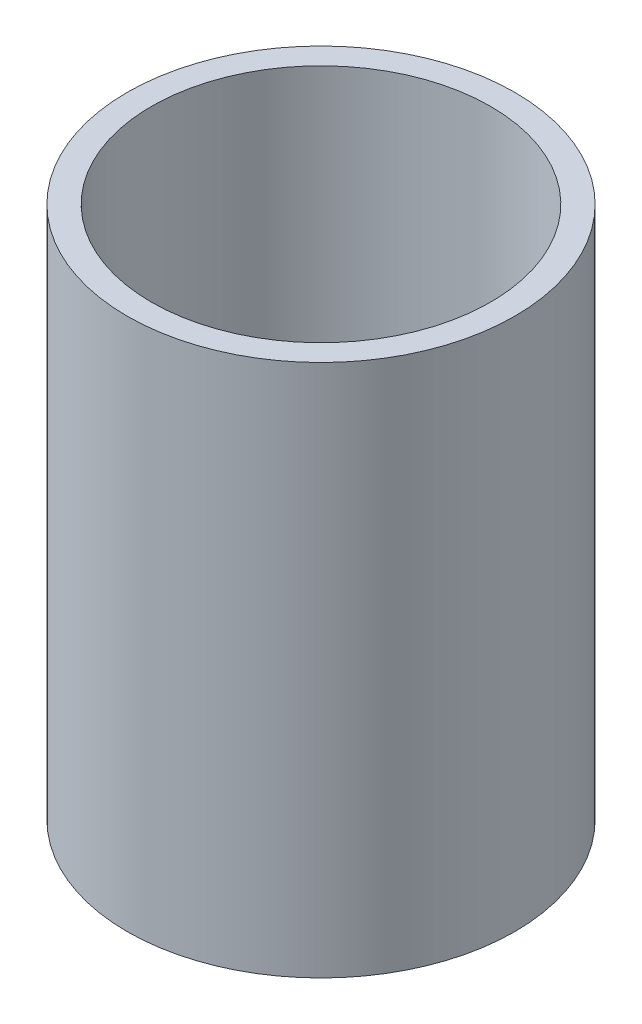
ISO-10303-21;
HEADER;
FILE_DESCRIPTION(('STEP AP214'),'2;1');
FILE_NAME('part.step','',(''),(''),'','','');
FILE_SCHEMA(('AUTOMOTIVE_DESIGN { 1 0 10303 214 1 1 1 1 }'));
ENDSEC;
DATA;
#1=APPLICATION_CONTEXT('core data for automotive mechanical design processes');
#2=APPLICATION_PROTOCOL_DEFINITION('international standard','automotive_design',2000,#1);
#3=PRODUCT_CONTEXT('',#1,'mechanical');
#4=PRODUCT('Part','Part','',(#3));
#5=PRODUCT_RELATED_PRODUCT_CATEGORY('part','',(#4));
#6=PRODUCT_DEFINITION_FORMATION('','',#4);
#7=PRODUCT_DEFINITION_CONTEXT('part definition',#1,'design');
#8=PRODUCT_DEFINITION('design','',#6,#7);
#9=PRODUCT_DEFINITION_SHAPE('','',#8);
#10=(LENGTH_UNIT() NAMED_UNIT(*) SI_UNIT(.MILLI.,.METRE.));
#11=(NAMED_UNIT(*) PLANE_ANGLE_UNIT() SI_UNIT($,.RADIAN.));
#12=(NAMED_UNIT(*) SI_UNIT($,.STERADIAN.) SOLID_ANGLE_UNIT());
#13=UNCERTAINTY_MEASURE_WITH_UNIT(LENGTH_MEASURE(1.E-05),#10,'distance_accuracy_value','');
#14=(GEOMETRIC_REPRESENTATION_CONTEXT(3) GLOBAL_UNCERTAINTY_ASSIGNED_CONTEXT((#13)) GLOBAL_UNIT_ASSIGNED_CONTEXT((#10,
#11,#12)) REPRESENTATION_CONTEXT('',''));
#15=CARTESIAN_POINT('',(0.,0.,0.));
#16=DIRECTION('',(0.,0.,1.));
#17=DIRECTION('',(1.,0.,0.));
#18=AXIS2_PLACEMENT_3D('',#15,#16,#17);
#19=CARTESIAN_POINT('',(0.,55.,0.));
#20=DIRECTION('',(0.,1.,0.));
#21=DIRECTION('',(0.,0.,1.));
#22=AXIS2_PLACEMENT_3D('',#19,#20,#21);
#23=PLANE('',#22);
#24=CARTESIAN_POINT('',(0.,55.,0.));
#25=DIRECTION('',(0.,1.,0.));
#26=DIRECTION('',(0.,0.,1.));
#27=AXIS2_PLACEMENT_3D('',#24,#25,#26);
#28=CIRCLE('',#27,40.);
#29=CARTESIAN_POINT('',(0.,55.,40.));
#30=VERTEX_POINT('',#29);
#31=EDGE_CURVE('E10',#30,#30,#28,.T.);
#32=ORIENTED_EDGE('',*,*,#31,.T.);
#33=EDGE_LOOP('',(#32));
#34=FACE_BOUND('',#33,.T.);
#35=CARTESIAN_POINT('',(0.,55.,0.));
#36=DIRECTION('',(0.,1.,0.));
#37=DIRECTION('',(0.,0.,1.));
#38=AXIS2_PLACEMENT_3D('',#35,#36,#37);
#39=CIRCLE('',#38,35.);
#40=CARTESIAN_POINT('',(0.,55.,35.));
#41=VERTEX_POINT('',#40);
#42=EDGE_CURVE('E44',#41,#41,#39,.T.);
#43=ORIENTED_EDGE('',*,*,#42,.F.);
#44=EDGE_LOOP('',(#43));
#45=FACE_BOUND('',#44,.T.);
#46=ADVANCED_FACE('F33',(#34,#45),#23,.T.);
#47=CARTESIAN_POINT('',(0.,-55.,0.));
#48=DIRECTION('',(0.,1.,0.));
#49=DIRECTION('',(0.,0.,1.));
#50=AXIS2_PLACEMENT_3D('',#47,#48,#49);
#51=PLANE('',#50);
#52=CARTESIAN_POINT('',(0.,-55.,0.));
#53=DIRECTION('',(0.,1.,0.));
#54=DIRECTION('',(0.,0.,1.));
#55=AXIS2_PLACEMENT_3D('',#52,#53,#54);
#56=CIRCLE('',#55,40.);
#57=CARTESIAN_POINT('',(0.,-55.,40.));
#58=VERTEX_POINT('',#57);
#59=EDGE_CURVE('E37',#58,#58,#56,.T.);
#60=ORIENTED_EDGE('',*,*,#59,.F.);
#61=EDGE_LOOP('',(#60));
#62=FACE_BOUND('',#61,.T.);
#63=CARTESIAN_POINT('',(0.,-55.,0.));
#64=DIRECTION('',(0.,1.,0.));
#65=DIRECTION('',(0.,0.,1.));
#66=AXIS2_PLACEMENT_3D('',#63,#64,#65);
#67=CIRCLE('',#66,35.);
#68=CARTESIAN_POINT('',(0.,-55.,35.));
#69=VERTEX_POINT('',#68);
#70=EDGE_CURVE('E46',#69,#69,#67,.T.);
#71=ORIENTED_EDGE('',*,*,#70,.T.);
#72=EDGE_LOOP('',(#71));
#73=FACE_BOUND('',#72,.T.);
#74=ADVANCED_FACE('F56',(#62,#73),#51,.F.);
#75=CARTESIAN_POINT('',(0.,55.,0.));
#76=DIRECTION('',(0.,-1.,0.));
#77=DIRECTION('',(0.,0.,-1.));
#78=AXIS2_PLACEMENT_3D('',#75,#76,#77);
#79=CYLINDRICAL_SURFACE('',#78,40.);
#80=ORIENTED_EDGE('',*,*,#31,.F.);
#81=EDGE_LOOP('',(#80));
#82=FACE_BOUND('',#81,.T.);
#83=ORIENTED_EDGE('',*,*,#59,.T.);
#84=EDGE_LOOP('',(#83));
#85=FACE_BOUND('',#84,.T.);
#86=ADVANCED_FACE('F35',(#82,#85),#79,.T.);
#87=CARTESIAN_POINT('',(0.,55.,0.));
#88=DIRECTION('',(0.,-1.,0.));
#89=DIRECTION('',(0.,0.,-1.));
#90=AXIS2_PLACEMENT_3D('',#87,#88,#89);
#91=CYLINDRICAL_SURFACE('',#90,35.);
#92=ORIENTED_EDGE('',*,*,#42,.T.);
#93=EDGE_LOOP('',(#92));
#94=FACE_BOUND('',#93,.T.);
#95=ORIENTED_EDGE('',*,*,#70,.F.);
#96=EDGE_LOOP('',(#95));
#97=FACE_BOUND('',#96,.T.);
#98=ADVANCED_FACE('F52',(#94,#97),#91,.F.);
#99=CLOSED_SHELL('',(#46,#74,#86,#98));
#100=MANIFOLD_SOLID_BREP('B2',#99);
#101=ADVANCED_BREP_SHAPE_REPRESENTATION('',(#18,#100),#14);
#102=SHAPE_DEFINITION_REPRESENTATION(#9,#101);
ENDSEC;
END-ISO-10303-21;
